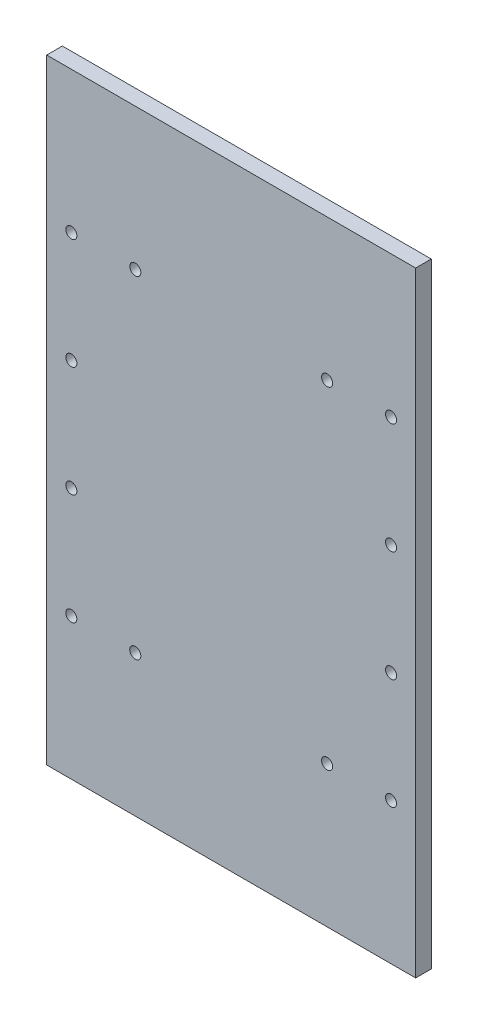
ISO-10303-21;
HEADER;
FILE_DESCRIPTION(('STEP AP214'),'2;1');
FILE_NAME('part.step','',(''),(''),'','','');
FILE_SCHEMA(('AUTOMOTIVE_DESIGN { 1 0 10303 214 1 1 1 1 }'));
ENDSEC;
DATA;
#1=APPLICATION_CONTEXT('core data for automotive mechanical design processes');
#2=APPLICATION_PROTOCOL_DEFINITION('international standard','automotive_design',2000,#1);
#3=PRODUCT_CONTEXT('',#1,'mechanical');
#4=PRODUCT('Part','Part','',(#3));
#5=PRODUCT_RELATED_PRODUCT_CATEGORY('part','',(#4));
#6=PRODUCT_DEFINITION_FORMATION('','',#4);
#7=PRODUCT_DEFINITION_CONTEXT('part definition',#1,'design');
#8=PRODUCT_DEFINITION('design','',#6,#7);
#9=PRODUCT_DEFINITION_SHAPE('','',#8);
#10=(LENGTH_UNIT() NAMED_UNIT(*) SI_UNIT(.MILLI.,.METRE.));
#11=(NAMED_UNIT(*) PLANE_ANGLE_UNIT() SI_UNIT($,.RADIAN.));
#12=(NAMED_UNIT(*) SI_UNIT($,.STERADIAN.) SOLID_ANGLE_UNIT());
#13=UNCERTAINTY_MEASURE_WITH_UNIT(LENGTH_MEASURE(1.E-05),#10,'distance_accuracy_value','');
#14=(GEOMETRIC_REPRESENTATION_CONTEXT(3) GLOBAL_UNCERTAINTY_ASSIGNED_CONTEXT((#13)) GLOBAL_UNIT_ASSIGNED_CONTEXT((#10,
#11,#12)) REPRESENTATION_CONTEXT('',''));
#15=CARTESIAN_POINT('',(0.,0.,0.));
#16=DIRECTION('',(0.,0.,1.));
#17=DIRECTION('',(1.,0.,0.));
#18=AXIS2_PLACEMENT_3D('',#15,#16,#17);
#19=CARTESIAN_POINT('',(0.,0.,6.35));
#20=DIRECTION('',(0.,0.,-1.));
#21=DIRECTION('',(-1.,0.,0.));
#22=AXIS2_PLACEMENT_3D('',#19,#20,#21);
#23=PLANE('',#22);
#24=CARTESIAN_POINT('',(36.,57.5,6.35));
#25=DIRECTION('',(0.,0.,1.));
#26=DIRECTION('',(1.,0.,0.));
#27=AXIS2_PLACEMENT_3D('',#24,#25,#26);
#28=CIRCLE('',#27,2.25);
#29=CARTESIAN_POINT('',(38.25,57.5,6.35));
#30=VERTEX_POINT('',#29);
#31=EDGE_CURVE('E179',#30,#30,#28,.T.);
#32=ORIENTED_EDGE('',*,*,#31,.F.);
#33=EDGE_LOOP('',(#32));
#34=FACE_BOUND('',#33,.T.);
#35=CARTESIAN_POINT('',(36.,192.5,6.35));
#36=DIRECTION('',(0.,0.,1.));
#37=DIRECTION('',(1.,0.,0.));
#38=AXIS2_PLACEMENT_3D('',#35,#36,#37);
#39=CIRCLE('',#38,2.25);
#40=CARTESIAN_POINT('',(38.25,192.5,6.35));
#41=VERTEX_POINT('',#40);
#42=EDGE_CURVE('E173',#41,#41,#39,.T.);
#43=ORIENTED_EDGE('',*,*,#42,.F.);
#44=EDGE_LOOP('',(#43));
#45=FACE_BOUND('',#44,.T.);
#46=CARTESIAN_POINT('',(114.,192.5,6.35));
#47=DIRECTION('',(0.,0.,1.));
#48=DIRECTION('',(1.,0.,0.));
#49=AXIS2_PLACEMENT_3D('',#46,#47,#48);
#50=CIRCLE('',#49,2.25);
#51=CARTESIAN_POINT('',(116.25,192.5,6.35));
#52=VERTEX_POINT('',#51);
#53=EDGE_CURVE('E167',#52,#52,#50,.T.);
#54=ORIENTED_EDGE('',*,*,#53,.F.);
#55=EDGE_LOOP('',(#54));
#56=FACE_BOUND('',#55,.T.);
#57=CARTESIAN_POINT('',(10.,192.5,6.35));
#58=DIRECTION('',(0.,0.,1.));
#59=DIRECTION('',(1.,0.,0.));
#60=AXIS2_PLACEMENT_3D('',#57,#58,#59);
#61=CIRCLE('',#60,2.25);
#62=CARTESIAN_POINT('',(12.25,192.5,6.35));
#63=VERTEX_POINT('',#62);
#64=EDGE_CURVE('E155',#63,#63,#61,.T.);
#65=ORIENTED_EDGE('',*,*,#64,.F.);
#66=EDGE_LOOP('',(#65));
#67=FACE_BOUND('',#66,.T.);
#68=CARTESIAN_POINT('',(10.,147.5,6.35));
#69=DIRECTION('',(0.,0.,1.));
#70=DIRECTION('',(1.,0.,0.));
#71=AXIS2_PLACEMENT_3D('',#68,#69,#70);
#72=CIRCLE('',#71,2.25);
#73=CARTESIAN_POINT('',(12.25,147.5,6.35));
#74=VERTEX_POINT('',#73);
#75=EDGE_CURVE('E149',#74,#74,#72,.T.);
#76=ORIENTED_EDGE('',*,*,#75,.F.);
#77=EDGE_LOOP('',(#76));
#78=FACE_BOUND('',#77,.T.);
#79=CARTESIAN_POINT('',(10.,102.5,6.35));
#80=DIRECTION('',(0.,0.,1.));
#81=DIRECTION('',(1.,0.,0.));
#82=AXIS2_PLACEMENT_3D('',#79,#80,#81);
#83=CIRCLE('',#82,2.25);
#84=CARTESIAN_POINT('',(12.25,102.5,6.35));
#85=VERTEX_POINT('',#84);
#86=EDGE_CURVE('E143',#85,#85,#83,.T.);
#87=ORIENTED_EDGE('',*,*,#86,.F.);
#88=EDGE_LOOP('',(#87));
#89=FACE_BOUND('',#88,.T.);
#90=CARTESIAN_POINT('',(140.,192.5,6.35));
#91=DIRECTION('',(0.,0.,1.));
#92=DIRECTION('',(1.,0.,0.));
#93=AXIS2_PLACEMENT_3D('',#90,#91,#92);
#94=CIRCLE('',#93,2.25);
#95=CARTESIAN_POINT('',(142.25,192.5,6.35));
#96=VERTEX_POINT('',#95);
#97=EDGE_CURVE('E137',#96,#96,#94,.T.);
#98=ORIENTED_EDGE('',*,*,#97,.F.);
#99=EDGE_LOOP('',(#98));
#100=FACE_BOUND('',#99,.T.);
#101=CARTESIAN_POINT('',(140.,147.5,6.35));
#102=DIRECTION('',(0.,0.,1.));
#103=DIRECTION('',(1.,0.,0.));
#104=AXIS2_PLACEMENT_3D('',#101,#102,#103);
#105=CIRCLE('',#104,2.25);
#106=CARTESIAN_POINT('',(142.25,147.5,6.35));
#107=VERTEX_POINT('',#106);
#108=EDGE_CURVE('E131',#107,#107,#105,.T.);
#109=ORIENTED_EDGE('',*,*,#108,.F.);
#110=EDGE_LOOP('',(#109));
#111=FACE_BOUND('',#110,.T.);
#112=CARTESIAN_POINT('',(140.,102.5,6.35));
#113=DIRECTION('',(0.,0.,1.));
#114=DIRECTION('',(1.,0.,0.));
#115=AXIS2_PLACEMENT_3D('',#112,#113,#114);
#116=CIRCLE('',#115,2.25);
#117=CARTESIAN_POINT('',(142.25,102.5,6.35));
#118=VERTEX_POINT('',#117);
#119=EDGE_CURVE('E125',#118,#118,#116,.T.);
#120=ORIENTED_EDGE('',*,*,#119,.F.);
#121=EDGE_LOOP('',(#120));
#122=FACE_BOUND('',#121,.T.);
#123=CARTESIAN_POINT('',(10.,57.5,6.35));
#124=DIRECTION('',(0.,0.,1.));
#125=DIRECTION('',(1.,0.,0.));
#126=AXIS2_PLACEMENT_3D('',#123,#124,#125);
#127=CIRCLE('',#126,2.25);
#128=CARTESIAN_POINT('',(12.25,57.5,6.35));
#129=VERTEX_POINT('',#128);
#130=EDGE_CURVE('E119',#129,#129,#127,.T.);
#131=ORIENTED_EDGE('',*,*,#130,.F.);
#132=EDGE_LOOP('',(#131));
#133=FACE_BOUND('',#132,.T.);
#134=CARTESIAN_POINT('',(140.,57.5,6.35));
#135=DIRECTION('',(0.,0.,1.));
#136=DIRECTION('',(1.,0.,0.));
#137=AXIS2_PLACEMENT_3D('',#134,#135,#136);
#138=CIRCLE('',#137,2.25);
#139=CARTESIAN_POINT('',(142.25,57.5,6.35));
#140=VERTEX_POINT('',#139);
#141=EDGE_CURVE('E113',#140,#140,#138,.T.);
#142=ORIENTED_EDGE('',*,*,#141,.F.);
#143=EDGE_LOOP('',(#142));
#144=FACE_BOUND('',#143,.T.);
#145=DIRECTION('',(0.,-1.,0.));
#146=VECTOR('',#145,1.);
#147=CARTESIAN_POINT('',(0.,0.,6.35));
#148=LINE('',#147,#146);
#149=CARTESIAN_POINT('',(0.,250.,6.35));
#150=VERTEX_POINT('',#149);
#151=CARTESIAN_POINT('',(0.,0.,6.35));
#152=VERTEX_POINT('',#151);
#153=EDGE_CURVE('E85',#150,#152,#148,.T.);
#154=ORIENTED_EDGE('',*,*,#153,.T.);
#155=DIRECTION('',(1.,0.,0.));
#156=VECTOR('',#155,1.);
#157=CARTESIAN_POINT('',(0.,0.,6.35));
#158=LINE('',#157,#156);
#159=CARTESIAN_POINT('',(150.,0.,6.35));
#160=VERTEX_POINT('',#159);
#161=EDGE_CURVE('E80',#152,#160,#158,.T.);
#162=ORIENTED_EDGE('',*,*,#161,.T.);
#163=DIRECTION('',(0.,1.,0.));
#164=VECTOR('',#163,1.);
#165=CARTESIAN_POINT('',(150.,0.,6.35));
#166=LINE('',#165,#164);
#167=CARTESIAN_POINT('',(150.,250.,6.35));
#168=VERTEX_POINT('',#167);
#169=EDGE_CURVE('E83',#160,#168,#166,.T.);
#170=ORIENTED_EDGE('',*,*,#169,.T.);
#171=DIRECTION('',(-1.,0.,0.));
#172=VECTOR('',#171,1.);
#173=CARTESIAN_POINT('',(0.,250.,6.35));
#174=LINE('',#173,#172);
#175=EDGE_CURVE('E50',#168,#150,#174,.T.);
#176=ORIENTED_EDGE('',*,*,#175,.T.);
#177=EDGE_LOOP('',(#154,#162,#170,#176));
#178=FACE_BOUND('',#177,.T.);
#179=CARTESIAN_POINT('',(114.,57.5,6.35));
#180=DIRECTION('',(0.,0.,1.));
#181=DIRECTION('',(1.,0.,0.));
#182=AXIS2_PLACEMENT_3D('',#179,#180,#181);
#183=CIRCLE('',#182,2.25);
#184=CARTESIAN_POINT('',(116.25,57.5,6.35));
#185=VERTEX_POINT('',#184);
#186=EDGE_CURVE('E161',#185,#185,#183,.T.);
#187=ORIENTED_EDGE('',*,*,#186,.F.);
#188=EDGE_LOOP('',(#187));
#189=FACE_BOUND('',#188,.T.);
#190=ADVANCED_FACE('F33',(#34,#45,#56,#67,#78,#89,#100,#111,#122,#133,#144,#178,#189),#23,.F.);
#191=CARTESIAN_POINT('',(0.,0.,6.35));
#192=DIRECTION('',(1.,0.,0.));
#193=DIRECTION('',(0.,0.,-1.));
#194=AXIS2_PLACEMENT_3D('',#191,#192,#193);
#195=PLANE('',#194);
#196=DIRECTION('',(0.,-1.,0.));
#197=VECTOR('',#196,1.);
#198=CARTESIAN_POINT('',(0.,0.,0.));
#199=LINE('',#198,#197);
#200=CARTESIAN_POINT('',(0.,250.,0.));
#201=VERTEX_POINT('',#200);
#202=CARTESIAN_POINT('',(0.,0.,0.));
#203=VERTEX_POINT('',#202);
#204=EDGE_CURVE('E97',#201,#203,#199,.T.);
#205=ORIENTED_EDGE('',*,*,#204,.T.);
#206=DIRECTION('',(0.,0.,-1.));
#207=VECTOR('',#206,1.);
#208=CARTESIAN_POINT('',(0.,0.,6.35));
#209=LINE('',#208,#207);
#210=EDGE_CURVE('E11',#152,#203,#209,.T.);
#211=ORIENTED_EDGE('',*,*,#210,.F.);
#212=ORIENTED_EDGE('',*,*,#153,.F.);
#213=DIRECTION('',(0.,0.,-1.));
#214=VECTOR('',#213,1.);
#215=CARTESIAN_POINT('',(0.,250.,6.35));
#216=LINE('',#215,#214);
#217=EDGE_CURVE('E93',#150,#201,#216,.T.);
#218=ORIENTED_EDGE('',*,*,#217,.T.);
#219=EDGE_LOOP('',(#205,#211,#212,#218));
#220=FACE_BOUND('',#219,.T.);
#221=ADVANCED_FACE('F35',(#220),#195,.F.);
#222=CARTESIAN_POINT('',(0.,0.,6.35));
#223=DIRECTION('',(0.,1.,0.));
#224=DIRECTION('',(0.,0.,1.));
#225=AXIS2_PLACEMENT_3D('',#222,#223,#224);
#226=PLANE('',#225);
#227=DIRECTION('',(1.,0.,0.));
#228=VECTOR('',#227,1.);
#229=CARTESIAN_POINT('',(0.,0.,0.));
#230=LINE('',#229,#228);
#231=CARTESIAN_POINT('',(150.,0.,0.));
#232=VERTEX_POINT('',#231);
#233=EDGE_CURVE('E89',#203,#232,#230,.T.);
#234=ORIENTED_EDGE('',*,*,#233,.T.);
#235=DIRECTION('',(0.,0.,-1.));
#236=VECTOR('',#235,1.);
#237=CARTESIAN_POINT('',(150.,0.,6.35));
#238=LINE('',#237,#236);
#239=EDGE_CURVE('E42',#160,#232,#238,.T.);
#240=ORIENTED_EDGE('',*,*,#239,.F.);
#241=ORIENTED_EDGE('',*,*,#161,.F.);
#242=ORIENTED_EDGE('',*,*,#210,.T.);
#243=EDGE_LOOP('',(#234,#240,#241,#242));
#244=FACE_BOUND('',#243,.T.);
#245=ADVANCED_FACE('F88',(#244),#226,.F.);
#246=CARTESIAN_POINT('',(150.,0.,6.35));
#247=DIRECTION('',(-1.,0.,0.));
#248=DIRECTION('',(0.,0.,1.));
#249=AXIS2_PLACEMENT_3D('',#246,#247,#248);
#250=PLANE('',#249);
#251=DIRECTION('',(0.,1.,0.));
#252=VECTOR('',#251,1.);
#253=CARTESIAN_POINT('',(150.,0.,0.));
#254=LINE('',#253,#252);
#255=CARTESIAN_POINT('',(150.,250.,0.));
#256=VERTEX_POINT('',#255);
#257=EDGE_CURVE('E67',#232,#256,#254,.T.);
#258=ORIENTED_EDGE('',*,*,#257,.T.);
#259=DIRECTION('',(0.,0.,-1.));
#260=VECTOR('',#259,1.);
#261=CARTESIAN_POINT('',(150.,250.,6.35));
#262=LINE('',#261,#260);
#263=EDGE_CURVE('E90',#168,#256,#262,.T.);
#264=ORIENTED_EDGE('',*,*,#263,.F.);
#265=ORIENTED_EDGE('',*,*,#169,.F.);
#266=ORIENTED_EDGE('',*,*,#239,.T.);
#267=EDGE_LOOP('',(#258,#264,#265,#266));
#268=FACE_BOUND('',#267,.T.);
#269=ADVANCED_FACE('F91',(#268),#250,.F.);
#270=CARTESIAN_POINT('',(0.,250.,6.35));
#271=DIRECTION('',(0.,-1.,0.));
#272=DIRECTION('',(0.,0.,-1.));
#273=AXIS2_PLACEMENT_3D('',#270,#271,#272);
#274=PLANE('',#273);
#275=DIRECTION('',(-1.,0.,0.));
#276=VECTOR('',#275,1.);
#277=CARTESIAN_POINT('',(0.,250.,0.));
#278=LINE('',#277,#276);
#279=EDGE_CURVE('E73',#256,#201,#278,.T.);
#280=ORIENTED_EDGE('',*,*,#279,.T.);
#281=ORIENTED_EDGE('',*,*,#217,.F.);
#282=ORIENTED_EDGE('',*,*,#175,.F.);
#283=ORIENTED_EDGE('',*,*,#263,.T.);
#284=EDGE_LOOP('',(#280,#281,#282,#283));
#285=FACE_BOUND('',#284,.T.);
#286=ADVANCED_FACE('F105',(#285),#274,.F.);
#287=CARTESIAN_POINT('',(0.,0.,0.));
#288=DIRECTION('',(0.,0.,-1.));
#289=DIRECTION('',(-1.,0.,0.));
#290=AXIS2_PLACEMENT_3D('',#287,#288,#289);
#291=PLANE('',#290);
#292=CARTESIAN_POINT('',(36.,57.5,0.));
#293=DIRECTION('',(0.,0.,1.));
#294=DIRECTION('',(1.,0.,0.));
#295=AXIS2_PLACEMENT_3D('',#292,#293,#294);
#296=CIRCLE('',#295,2.25);
#297=CARTESIAN_POINT('',(38.25,57.5,0.));
#298=VERTEX_POINT('',#297);
#299=EDGE_CURVE('E176',#298,#298,#296,.T.);
#300=ORIENTED_EDGE('',*,*,#299,.T.);
#301=EDGE_LOOP('',(#300));
#302=FACE_BOUND('',#301,.T.);
#303=CARTESIAN_POINT('',(36.,192.5,0.));
#304=DIRECTION('',(0.,0.,1.));
#305=DIRECTION('',(1.,0.,0.));
#306=AXIS2_PLACEMENT_3D('',#303,#304,#305);
#307=CIRCLE('',#306,2.25);
#308=CARTESIAN_POINT('',(38.25,192.5,0.));
#309=VERTEX_POINT('',#308);
#310=EDGE_CURVE('E170',#309,#309,#307,.T.);
#311=ORIENTED_EDGE('',*,*,#310,.T.);
#312=EDGE_LOOP('',(#311));
#313=FACE_BOUND('',#312,.T.);
#314=CARTESIAN_POINT('',(114.,192.5,0.));
#315=DIRECTION('',(0.,0.,1.));
#316=DIRECTION('',(1.,0.,0.));
#317=AXIS2_PLACEMENT_3D('',#314,#315,#316);
#318=CIRCLE('',#317,2.25);
#319=CARTESIAN_POINT('',(116.25,192.5,0.));
#320=VERTEX_POINT('',#319);
#321=EDGE_CURVE('E164',#320,#320,#318,.T.);
#322=ORIENTED_EDGE('',*,*,#321,.T.);
#323=EDGE_LOOP('',(#322));
#324=FACE_BOUND('',#323,.T.);
#325=CARTESIAN_POINT('',(114.,57.5,0.));
#326=DIRECTION('',(0.,0.,1.));
#327=DIRECTION('',(1.,0.,0.));
#328=AXIS2_PLACEMENT_3D('',#325,#326,#327);
#329=CIRCLE('',#328,2.25);
#330=CARTESIAN_POINT('',(116.25,57.5,0.));
#331=VERTEX_POINT('',#330);
#332=EDGE_CURVE('E158',#331,#331,#329,.T.);
#333=ORIENTED_EDGE('',*,*,#332,.T.);
#334=EDGE_LOOP('',(#333));
#335=FACE_BOUND('',#334,.T.);
#336=CARTESIAN_POINT('',(10.,192.5,0.));
#337=DIRECTION('',(0.,0.,1.));
#338=DIRECTION('',(1.,0.,0.));
#339=AXIS2_PLACEMENT_3D('',#336,#337,#338);
#340=CIRCLE('',#339,2.25);
#341=CARTESIAN_POINT('',(12.25,192.5,0.));
#342=VERTEX_POINT('',#341);
#343=EDGE_CURVE('E152',#342,#342,#340,.T.);
#344=ORIENTED_EDGE('',*,*,#343,.T.);
#345=EDGE_LOOP('',(#344));
#346=FACE_BOUND('',#345,.T.);
#347=CARTESIAN_POINT('',(10.,147.5,0.));
#348=DIRECTION('',(0.,0.,1.));
#349=DIRECTION('',(1.,0.,0.));
#350=AXIS2_PLACEMENT_3D('',#347,#348,#349);
#351=CIRCLE('',#350,2.25);
#352=CARTESIAN_POINT('',(12.25,147.5,0.));
#353=VERTEX_POINT('',#352);
#354=EDGE_CURVE('E146',#353,#353,#351,.T.);
#355=ORIENTED_EDGE('',*,*,#354,.T.);
#356=EDGE_LOOP('',(#355));
#357=FACE_BOUND('',#356,.T.);
#358=CARTESIAN_POINT('',(10.,102.5,0.));
#359=DIRECTION('',(0.,0.,1.));
#360=DIRECTION('',(1.,0.,0.));
#361=AXIS2_PLACEMENT_3D('',#358,#359,#360);
#362=CIRCLE('',#361,2.25);
#363=CARTESIAN_POINT('',(12.25,102.5,0.));
#364=VERTEX_POINT('',#363);
#365=EDGE_CURVE('E140',#364,#364,#362,.T.);
#366=ORIENTED_EDGE('',*,*,#365,.T.);
#367=EDGE_LOOP('',(#366));
#368=FACE_BOUND('',#367,.T.);
#369=CARTESIAN_POINT('',(140.,192.5,0.));
#370=DIRECTION('',(0.,0.,1.));
#371=DIRECTION('',(1.,0.,0.));
#372=AXIS2_PLACEMENT_3D('',#369,#370,#371);
#373=CIRCLE('',#372,2.25);
#374=CARTESIAN_POINT('',(142.25,192.5,0.));
#375=VERTEX_POINT('',#374);
#376=EDGE_CURVE('E134',#375,#375,#373,.T.);
#377=ORIENTED_EDGE('',*,*,#376,.T.);
#378=EDGE_LOOP('',(#377));
#379=FACE_BOUND('',#378,.T.);
#380=CARTESIAN_POINT('',(140.,147.5,0.));
#381=DIRECTION('',(0.,0.,1.));
#382=DIRECTION('',(1.,0.,0.));
#383=AXIS2_PLACEMENT_3D('',#380,#381,#382);
#384=CIRCLE('',#383,2.25);
#385=CARTESIAN_POINT('',(142.25,147.5,0.));
#386=VERTEX_POINT('',#385);
#387=EDGE_CURVE('E128',#386,#386,#384,.T.);
#388=ORIENTED_EDGE('',*,*,#387,.T.);
#389=EDGE_LOOP('',(#388));
#390=FACE_BOUND('',#389,.T.);
#391=CARTESIAN_POINT('',(140.,102.5,0.));
#392=DIRECTION('',(0.,0.,1.));
#393=DIRECTION('',(1.,0.,0.));
#394=AXIS2_PLACEMENT_3D('',#391,#392,#393);
#395=CIRCLE('',#394,2.25);
#396=CARTESIAN_POINT('',(142.25,102.5,0.));
#397=VERTEX_POINT('',#396);
#398=EDGE_CURVE('E122',#397,#397,#395,.T.);
#399=ORIENTED_EDGE('',*,*,#398,.T.);
#400=EDGE_LOOP('',(#399));
#401=FACE_BOUND('',#400,.T.);
#402=CARTESIAN_POINT('',(10.,57.5,0.));
#403=DIRECTION('',(0.,0.,1.));
#404=DIRECTION('',(1.,0.,0.));
#405=AXIS2_PLACEMENT_3D('',#402,#403,#404);
#406=CIRCLE('',#405,2.25);
#407=CARTESIAN_POINT('',(12.25,57.5,0.));
#408=VERTEX_POINT('',#407);
#409=EDGE_CURVE('E116',#408,#408,#406,.T.);
#410=ORIENTED_EDGE('',*,*,#409,.T.);
#411=EDGE_LOOP('',(#410));
#412=FACE_BOUND('',#411,.T.);
#413=CARTESIAN_POINT('',(140.,57.5,0.));
#414=DIRECTION('',(0.,0.,1.));
#415=DIRECTION('',(1.,0.,0.));
#416=AXIS2_PLACEMENT_3D('',#413,#414,#415);
#417=CIRCLE('',#416,2.25);
#418=CARTESIAN_POINT('',(142.25,57.5,0.));
#419=VERTEX_POINT('',#418);
#420=EDGE_CURVE('E100',#419,#419,#417,.T.);
#421=ORIENTED_EDGE('',*,*,#420,.T.);
#422=EDGE_LOOP('',(#421));
#423=FACE_BOUND('',#422,.T.);
#424=ORIENTED_EDGE('',*,*,#204,.F.);
#425=ORIENTED_EDGE('',*,*,#279,.F.);
#426=ORIENTED_EDGE('',*,*,#257,.F.);
#427=ORIENTED_EDGE('',*,*,#233,.F.);
#428=EDGE_LOOP('',(#424,#425,#426,#427));
#429=FACE_BOUND('',#428,.T.);
#430=ADVANCED_FACE('F108',(#302,#313,#324,#335,#346,#357,#368,#379,#390,#401,#412,#423,#429),
#291,.T.);
#431=CARTESIAN_POINT('',(140.,57.5,6.35));
#432=DIRECTION('',(0.,0.,1.));
#433=DIRECTION('',(1.,0.,0.));
#434=AXIS2_PLACEMENT_3D('',#431,#432,#433);
#435=CYLINDRICAL_SURFACE('',#434,2.25);
#436=ORIENTED_EDGE('',*,*,#420,.F.);
#437=EDGE_LOOP('',(#436));
#438=FACE_BOUND('',#437,.T.);
#439=ORIENTED_EDGE('',*,*,#141,.T.);
#440=EDGE_LOOP('',(#439));
#441=FACE_BOUND('',#440,.T.);
#442=ADVANCED_FACE('F208',(#438,#441),#435,.F.);
#443=CARTESIAN_POINT('',(10.,57.5,6.35));
#444=DIRECTION('',(0.,0.,1.));
#445=DIRECTION('',(1.,0.,0.));
#446=AXIS2_PLACEMENT_3D('',#443,#444,#445);
#447=CYLINDRICAL_SURFACE('',#446,2.25);
#448=ORIENTED_EDGE('',*,*,#409,.F.);
#449=EDGE_LOOP('',(#448));
#450=FACE_BOUND('',#449,.T.);
#451=ORIENTED_EDGE('',*,*,#130,.T.);
#452=EDGE_LOOP('',(#451));
#453=FACE_BOUND('',#452,.T.);
#454=ADVANCED_FACE('F210',(#450,#453),#447,.F.);
#455=CARTESIAN_POINT('',(140.,102.5,6.35));
#456=DIRECTION('',(0.,0.,1.));
#457=DIRECTION('',(1.,0.,0.));
#458=AXIS2_PLACEMENT_3D('',#455,#456,#457);
#459=CYLINDRICAL_SURFACE('',#458,2.25);
#460=ORIENTED_EDGE('',*,*,#398,.F.);
#461=EDGE_LOOP('',(#460));
#462=FACE_BOUND('',#461,.T.);
#463=ORIENTED_EDGE('',*,*,#119,.T.);
#464=EDGE_LOOP('',(#463));
#465=FACE_BOUND('',#464,.T.);
#466=ADVANCED_FACE('F217',(#462,#465),#459,.F.);
#467=CARTESIAN_POINT('',(140.,147.5,6.35));
#468=DIRECTION('',(0.,0.,1.));
#469=DIRECTION('',(1.,0.,0.));
#470=AXIS2_PLACEMENT_3D('',#467,#468,#469);
#471=CYLINDRICAL_SURFACE('',#470,2.25);
#472=ORIENTED_EDGE('',*,*,#387,.F.);
#473=EDGE_LOOP('',(#472));
#474=FACE_BOUND('',#473,.T.);
#475=ORIENTED_EDGE('',*,*,#108,.T.);
#476=EDGE_LOOP('',(#475));
#477=FACE_BOUND('',#476,.T.);
#478=ADVANCED_FACE('F310',(#474,#477),#471,.F.);
#479=CARTESIAN_POINT('',(140.,192.5,6.35));
#480=DIRECTION('',(0.,0.,1.));
#481=DIRECTION('',(1.,0.,0.));
#482=AXIS2_PLACEMENT_3D('',#479,#480,#481);
#483=CYLINDRICAL_SURFACE('',#482,2.25);
#484=ORIENTED_EDGE('',*,*,#376,.F.);
#485=EDGE_LOOP('',(#484));
#486=FACE_BOUND('',#485,.T.);
#487=ORIENTED_EDGE('',*,*,#97,.T.);
#488=EDGE_LOOP('',(#487));
#489=FACE_BOUND('',#488,.T.);
#490=ADVANCED_FACE('F306',(#486,#489),#483,.F.);
#491=CARTESIAN_POINT('',(10.,102.5,6.35));
#492=DIRECTION('',(0.,0.,1.));
#493=DIRECTION('',(1.,0.,0.));
#494=AXIS2_PLACEMENT_3D('',#491,#492,#493);
#495=CYLINDRICAL_SURFACE('',#494,2.25);
#496=ORIENTED_EDGE('',*,*,#365,.F.);
#497=EDGE_LOOP('',(#496));
#498=FACE_BOUND('',#497,.T.);
#499=ORIENTED_EDGE('',*,*,#86,.T.);
#500=EDGE_LOOP('',(#499));
#501=FACE_BOUND('',#500,.T.);
#502=ADVANCED_FACE('F302',(#498,#501),#495,.F.);
#503=CARTESIAN_POINT('',(10.,147.5,6.35));
#504=DIRECTION('',(0.,0.,1.));
#505=DIRECTION('',(1.,0.,0.));
#506=AXIS2_PLACEMENT_3D('',#503,#504,#505);
#507=CYLINDRICAL_SURFACE('',#506,2.25);
#508=ORIENTED_EDGE('',*,*,#354,.F.);
#509=EDGE_LOOP('',(#508));
#510=FACE_BOUND('',#509,.T.);
#511=ORIENTED_EDGE('',*,*,#75,.T.);
#512=EDGE_LOOP('',(#511));
#513=FACE_BOUND('',#512,.T.);
#514=ADVANCED_FACE('F298',(#510,#513),#507,.F.);
#515=CARTESIAN_POINT('',(10.,192.5,6.35));
#516=DIRECTION('',(0.,0.,1.));
#517=DIRECTION('',(1.,0.,0.));
#518=AXIS2_PLACEMENT_3D('',#515,#516,#517);
#519=CYLINDRICAL_SURFACE('',#518,2.25);
#520=ORIENTED_EDGE('',*,*,#343,.F.);
#521=EDGE_LOOP('',(#520));
#522=FACE_BOUND('',#521,.T.);
#523=ORIENTED_EDGE('',*,*,#64,.T.);
#524=EDGE_LOOP('',(#523));
#525=FACE_BOUND('',#524,.T.);
#526=ADVANCED_FACE('F246',(#522,#525),#519,.F.);
#527=CARTESIAN_POINT('',(114.,57.5,6.35));
#528=DIRECTION('',(0.,0.,1.));
#529=DIRECTION('',(1.,0.,0.));
#530=AXIS2_PLACEMENT_3D('',#527,#528,#529);
#531=CYLINDRICAL_SURFACE('',#530,2.25);
#532=ORIENTED_EDGE('',*,*,#332,.F.);
#533=EDGE_LOOP('',(#532));
#534=FACE_BOUND('',#533,.T.);
#535=ORIENTED_EDGE('',*,*,#186,.T.);
#536=EDGE_LOOP('',(#535));
#537=FACE_BOUND('',#536,.T.);
#538=ADVANCED_FACE('F258',(#534,#537),#531,.F.);
#539=CARTESIAN_POINT('',(114.,192.5,6.35));
#540=DIRECTION('',(0.,0.,1.));
#541=DIRECTION('',(1.,0.,0.));
#542=AXIS2_PLACEMENT_3D('',#539,#540,#541);
#543=CYLINDRICAL_SURFACE('',#542,2.25);
#544=ORIENTED_EDGE('',*,*,#321,.F.);
#545=EDGE_LOOP('',(#544));
#546=FACE_BOUND('',#545,.T.);
#547=ORIENTED_EDGE('',*,*,#53,.T.);
#548=EDGE_LOOP('',(#547));
#549=FACE_BOUND('',#548,.T.);
#550=ADVANCED_FACE('F262',(#546,#549),#543,.F.);
#551=CARTESIAN_POINT('',(36.,192.5,6.35));
#552=DIRECTION('',(0.,0.,1.));
#553=DIRECTION('',(1.,0.,0.));
#554=AXIS2_PLACEMENT_3D('',#551,#552,#553);
#555=CYLINDRICAL_SURFACE('',#554,2.25);
#556=ORIENTED_EDGE('',*,*,#310,.F.);
#557=EDGE_LOOP('',(#556));
#558=FACE_BOUND('',#557,.T.);
#559=ORIENTED_EDGE('',*,*,#42,.T.);
#560=EDGE_LOOP('',(#559));
#561=FACE_BOUND('',#560,.T.);
#562=ADVANCED_FACE('F272',(#558,#561),#555,.F.);
#563=CARTESIAN_POINT('',(36.,57.5,6.35));
#564=DIRECTION('',(0.,0.,1.));
#565=DIRECTION('',(1.,0.,0.));
#566=AXIS2_PLACEMENT_3D('',#563,#564,#565);
#567=CYLINDRICAL_SURFACE('',#566,2.25);
#568=ORIENTED_EDGE('',*,*,#299,.F.);
#569=EDGE_LOOP('',(#568));
#570=FACE_BOUND('',#569,.T.);
#571=ORIENTED_EDGE('',*,*,#31,.T.);
#572=EDGE_LOOP('',(#571));
#573=FACE_BOUND('',#572,.T.);
#574=ADVANCED_FACE('F183',(#570,#573),#567,.F.);
#575=CLOSED_SHELL('',(#190,#221,#245,#269,#286,#430,#442,#454,#466,#478,#490,#502,#514,#526,
#538,#550,#562,#574));
#576=MANIFOLD_SOLID_BREP('B2',#575);
#577=ADVANCED_BREP_SHAPE_REPRESENTATION('',(#18,#576),#14);
#578=SHAPE_DEFINITION_REPRESENTATION(#9,#577);
ENDSEC;
END-ISO-10303-21;
